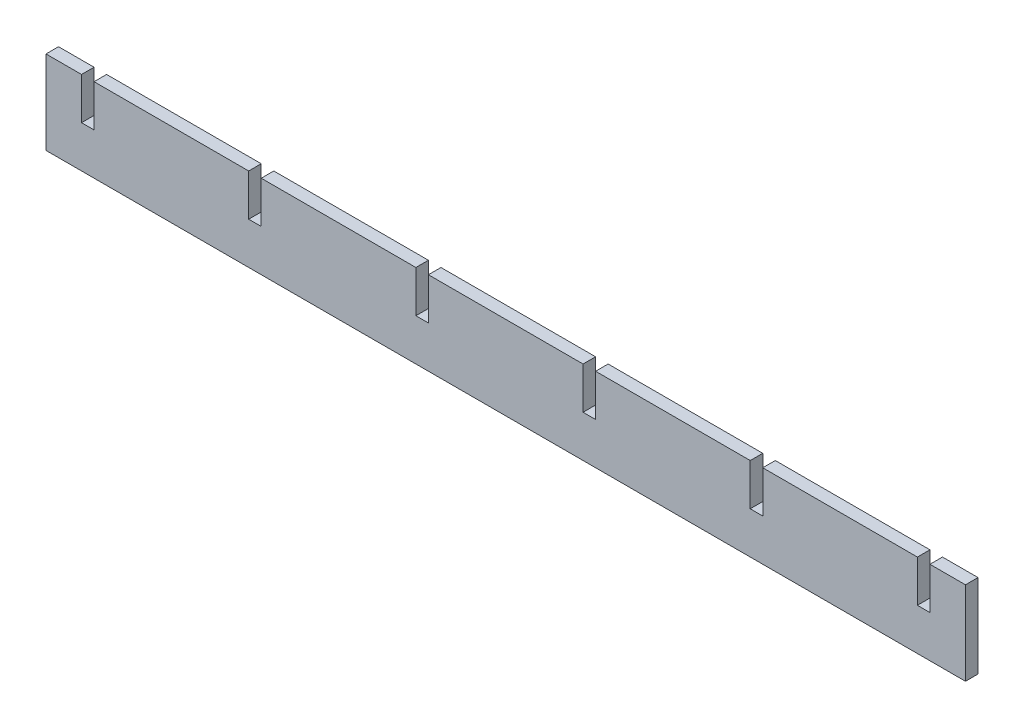
ISO-10303-21;
HEADER;
FILE_DESCRIPTION(('STEP AP214'),'2;1');
FILE_NAME('part.step','',(''),(''),'','','');
FILE_SCHEMA(('AUTOMOTIVE_DESIGN { 1 0 10303 214 1 1 1 1 }'));
ENDSEC;
DATA;
#1=APPLICATION_CONTEXT('core data for automotive mechanical design processes');
#2=APPLICATION_PROTOCOL_DEFINITION('international standard','automotive_design',2000,#1);
#3=PRODUCT_CONTEXT('',#1,'mechanical');
#4=PRODUCT('Part','Part','',(#3));
#5=PRODUCT_RELATED_PRODUCT_CATEGORY('part','',(#4));
#6=PRODUCT_DEFINITION_FORMATION('','',#4);
#7=PRODUCT_DEFINITION_CONTEXT('part definition',#1,'design');
#8=PRODUCT_DEFINITION('design','',#6,#7);
#9=PRODUCT_DEFINITION_SHAPE('','',#8);
#10=(LENGTH_UNIT() NAMED_UNIT(*) SI_UNIT(.MILLI.,.METRE.));
#11=(NAMED_UNIT(*) PLANE_ANGLE_UNIT() SI_UNIT($,.RADIAN.));
#12=(NAMED_UNIT(*) SI_UNIT($,.STERADIAN.) SOLID_ANGLE_UNIT());
#13=UNCERTAINTY_MEASURE_WITH_UNIT(LENGTH_MEASURE(1.E-05),#10,'distance_accuracy_value','');
#14=(GEOMETRIC_REPRESENTATION_CONTEXT(3) GLOBAL_UNCERTAINTY_ASSIGNED_CONTEXT((#13)) GLOBAL_UNIT_ASSIGNED_CONTEXT((#10,
#11,#12)) REPRESENTATION_CONTEXT('',''));
#15=CARTESIAN_POINT('',(0.,0.,0.));
#16=DIRECTION('',(0.,0.,1.));
#17=DIRECTION('',(1.,0.,0.));
#18=AXIS2_PLACEMENT_3D('',#15,#16,#17);
#19=CARTESIAN_POINT('',(0.,20.,3.));
#20=DIRECTION('',(0.,-1.,0.));
#21=DIRECTION('',(0.,0.,-1.));
#22=AXIS2_PLACEMENT_3D('',#19,#20,#21);
#23=PLANE('',#22);
#24=DIRECTION('',(0.,0.,-1.));
#25=VECTOR('',#24,1.);
#26=CARTESIAN_POINT('',(48.5,20.,3.));
#27=LINE('',#26,#25);
#28=CARTESIAN_POINT('',(48.5,20.,3.));
#29=VERTEX_POINT('',#28);
#30=CARTESIAN_POINT('',(48.5,20.,0.));
#31=VERTEX_POINT('',#30);
#32=EDGE_CURVE('E233',#29,#31,#27,.T.);
#33=ORIENTED_EDGE('',*,*,#32,.T.);
#34=DIRECTION('',(-1.,0.,0.));
#35=VECTOR('',#34,1.);
#36=CARTESIAN_POINT('',(0.,20.,0.));
#37=LINE('',#36,#35);
#38=CARTESIAN_POINT('',(11.5,20.,0.));
#39=VERTEX_POINT('',#38);
#40=EDGE_CURVE('E480',#31,#39,#37,.T.);
#41=ORIENTED_EDGE('',*,*,#40,.T.);
#42=DIRECTION('',(0.,0.,-1.));
#43=VECTOR('',#42,1.);
#44=CARTESIAN_POINT('',(11.5,20.,3.));
#45=LINE('',#44,#43);
#46=CARTESIAN_POINT('',(11.5,20.,3.));
#47=VERTEX_POINT('',#46);
#48=EDGE_CURVE('E435',#47,#39,#45,.T.);
#49=ORIENTED_EDGE('',*,*,#48,.F.);
#50=DIRECTION('',(-1.,0.,0.));
#51=VECTOR('',#50,1.);
#52=CARTESIAN_POINT('',(0.,20.,3.));
#53=LINE('',#52,#51);
#54=EDGE_CURVE('E465',#29,#47,#53,.T.);
#55=ORIENTED_EDGE('',*,*,#54,.F.);
#56=EDGE_LOOP('',(#33,#41,#49,#55));
#57=FACE_BOUND('',#56,.T.);
#58=ADVANCED_FACE('F39',(#57),#23,.F.);
#59=DIRECTION('',(0.,0.,-1.));
#60=VECTOR('',#59,1.);
#61=CARTESIAN_POINT('',(51.5,20.,3.));
#62=LINE('',#61,#60);
#63=CARTESIAN_POINT('',(51.5,20.,3.));
#64=VERTEX_POINT('',#63);
#65=CARTESIAN_POINT('',(51.5,20.,0.));
#66=VERTEX_POINT('',#65);
#67=EDGE_CURVE('E55',#64,#66,#62,.T.);
#68=ORIENTED_EDGE('',*,*,#67,.F.);
#69=CARTESIAN_POINT('',(88.5,20.,3.));
#70=VERTEX_POINT('',#69);
#71=EDGE_CURVE('E589',#70,#64,#53,.T.);
#72=ORIENTED_EDGE('',*,*,#71,.F.);
#73=DIRECTION('',(0.,0.,-1.));
#74=VECTOR('',#73,1.);
#75=CARTESIAN_POINT('',(88.5,20.,3.));
#76=LINE('',#75,#74);
#77=CARTESIAN_POINT('',(88.5,20.,0.));
#78=VERTEX_POINT('',#77);
#79=EDGE_CURVE('E283',#70,#78,#76,.T.);
#80=ORIENTED_EDGE('',*,*,#79,.T.);
#81=EDGE_CURVE('E517',#78,#66,#37,.T.);
#82=ORIENTED_EDGE('',*,*,#81,.T.);
#83=EDGE_LOOP('',(#68,#72,#80,#82));
#84=FACE_BOUND('',#83,.T.);
#85=ADVANCED_FACE('F538',(#84),#23,.F.);
#86=DIRECTION('',(0.,0.,-1.));
#87=VECTOR('',#86,1.);
#88=CARTESIAN_POINT('',(91.5,20.,3.));
#89=LINE('',#88,#87);
#90=CARTESIAN_POINT('',(91.5,20.,3.));
#91=VERTEX_POINT('',#90);
#92=CARTESIAN_POINT('',(91.5,20.,0.));
#93=VERTEX_POINT('',#92);
#94=EDGE_CURVE('E63',#91,#93,#89,.T.);
#95=ORIENTED_EDGE('',*,*,#94,.F.);
#96=CARTESIAN_POINT('',(128.5,20.,3.));
#97=VERTEX_POINT('',#96);
#98=EDGE_CURVE('E584',#97,#91,#53,.T.);
#99=ORIENTED_EDGE('',*,*,#98,.F.);
#100=DIRECTION('',(0.,0.,-1.));
#101=VECTOR('',#100,1.);
#102=CARTESIAN_POINT('',(128.5,20.,3.));
#103=LINE('',#102,#101);
#104=CARTESIAN_POINT('',(128.5,20.,0.));
#105=VERTEX_POINT('',#104);
#106=EDGE_CURVE('E316',#97,#105,#103,.T.);
#107=ORIENTED_EDGE('',*,*,#106,.T.);
#108=EDGE_CURVE('E526',#105,#93,#37,.T.);
#109=ORIENTED_EDGE('',*,*,#108,.T.);
#110=EDGE_LOOP('',(#95,#99,#107,#109));
#111=FACE_BOUND('',#110,.T.);
#112=ADVANCED_FACE('F554',(#111),#23,.F.);
#113=DIRECTION('',(0.,0.,-1.));
#114=VECTOR('',#113,1.);
#115=CARTESIAN_POINT('',(131.5,20.,3.));
#116=LINE('',#115,#114);
#117=CARTESIAN_POINT('',(131.5,20.,3.));
#118=VERTEX_POINT('',#117);
#119=CARTESIAN_POINT('',(131.5,20.,0.));
#120=VERTEX_POINT('',#119);
#121=EDGE_CURVE('E332',#118,#120,#116,.T.);
#122=ORIENTED_EDGE('',*,*,#121,.F.);
#123=CARTESIAN_POINT('',(168.5,20.,3.));
#124=VERTEX_POINT('',#123);
#125=EDGE_CURVE('E581',#124,#118,#53,.T.);
#126=ORIENTED_EDGE('',*,*,#125,.F.);
#127=DIRECTION('',(0.,0.,-1.));
#128=VECTOR('',#127,1.);
#129=CARTESIAN_POINT('',(168.5,20.,3.));
#130=LINE('',#129,#128);
#131=CARTESIAN_POINT('',(168.5,20.,0.));
#132=VERTEX_POINT('',#131);
#133=EDGE_CURVE('E351',#124,#132,#130,.T.);
#134=ORIENTED_EDGE('',*,*,#133,.T.);
#135=EDGE_CURVE('E520',#132,#120,#37,.T.);
#136=ORIENTED_EDGE('',*,*,#135,.T.);
#137=EDGE_LOOP('',(#122,#126,#134,#136));
#138=FACE_BOUND('',#137,.T.);
#139=ADVANCED_FACE('F569',(#138),#23,.F.);
#140=DIRECTION('',(0.,0.,-1.));
#141=VECTOR('',#140,1.);
#142=CARTESIAN_POINT('',(171.5,20.,3.));
#143=LINE('',#142,#141);
#144=CARTESIAN_POINT('',(171.5,20.,3.));
#145=VERTEX_POINT('',#144);
#146=CARTESIAN_POINT('',(171.5,20.,0.));
#147=VERTEX_POINT('',#146);
#148=EDGE_CURVE('E367',#145,#147,#143,.T.);
#149=ORIENTED_EDGE('',*,*,#148,.F.);
#150=CARTESIAN_POINT('',(208.5,20.,3.));
#151=VERTEX_POINT('',#150);
#152=EDGE_CURVE('E464',#151,#145,#53,.T.);
#153=ORIENTED_EDGE('',*,*,#152,.F.);
#154=DIRECTION('',(0.,0.,-1.));
#155=VECTOR('',#154,1.);
#156=CARTESIAN_POINT('',(208.5,20.,3.));
#157=LINE('',#156,#155);
#158=CARTESIAN_POINT('',(208.5,20.,0.));
#159=VERTEX_POINT('',#158);
#160=EDGE_CURVE('E386',#151,#159,#157,.T.);
#161=ORIENTED_EDGE('',*,*,#160,.T.);
#162=EDGE_CURVE('E479',#159,#147,#37,.T.);
#163=ORIENTED_EDGE('',*,*,#162,.T.);
#164=EDGE_LOOP('',(#149,#153,#161,#163));
#165=FACE_BOUND('',#164,.T.);
#166=ADVANCED_FACE('F563',(#165),#23,.F.);
#167=DIRECTION('',(0.,0.,-1.));
#168=VECTOR('',#167,1.);
#169=CARTESIAN_POINT('',(211.5,20.,3.));
#170=LINE('',#169,#168);
#171=CARTESIAN_POINT('',(211.5,20.,3.));
#172=VERTEX_POINT('',#171);
#173=CARTESIAN_POINT('',(211.5,20.,0.));
#174=VERTEX_POINT('',#173);
#175=EDGE_CURVE('E401',#172,#174,#170,.T.);
#176=ORIENTED_EDGE('',*,*,#175,.F.);
#177=CARTESIAN_POINT('',(220.,20.,3.));
#178=VERTEX_POINT('',#177);
#179=EDGE_CURVE('E459',#178,#172,#53,.T.);
#180=ORIENTED_EDGE('',*,*,#179,.F.);
#181=DIRECTION('',(0.,0.,-1.));
#182=VECTOR('',#181,1.);
#183=CARTESIAN_POINT('',(220.,20.,3.));
#184=LINE('',#183,#182);
#185=CARTESIAN_POINT('',(220.,20.,0.));
#186=VERTEX_POINT('',#185);
#187=EDGE_CURVE('E484',#178,#186,#184,.T.);
#188=ORIENTED_EDGE('',*,*,#187,.T.);
#189=EDGE_CURVE('E452',#186,#174,#37,.T.);
#190=ORIENTED_EDGE('',*,*,#189,.T.);
#191=EDGE_LOOP('',(#176,#180,#188,#190));
#192=FACE_BOUND('',#191,.T.);
#193=ADVANCED_FACE('F504',(#192),#23,.F.);
#194=CARTESIAN_POINT('',(0.,0.,3.));
#195=DIRECTION('',(0.,0.,-1.));
#196=DIRECTION('',(-1.,0.,0.));
#197=AXIS2_PLACEMENT_3D('',#194,#195,#196);
#198=PLANE('',#197);
#199=DIRECTION('',(0.,-1.,0.));
#200=VECTOR('',#199,1.);
#201=CARTESIAN_POINT('',(48.5,20.,3.));
#202=LINE('',#201,#200);
#203=CARTESIAN_POINT('',(48.5,10.,3.));
#204=VERTEX_POINT('',#203);
#205=EDGE_CURVE('E227',#29,#204,#202,.T.);
#206=ORIENTED_EDGE('',*,*,#205,.F.);
#207=ORIENTED_EDGE('',*,*,#54,.T.);
#208=DIRECTION('',(0.,1.,0.));
#209=VECTOR('',#208,1.);
#210=CARTESIAN_POINT('',(11.5,20.,3.));
#211=LINE('',#210,#209);
#212=CARTESIAN_POINT('',(11.5,10.,3.));
#213=VERTEX_POINT('',#212);
#214=EDGE_CURVE('E417',#213,#47,#211,.T.);
#215=ORIENTED_EDGE('',*,*,#214,.F.);
#216=DIRECTION('',(1.,0.,0.));
#217=VECTOR('',#216,1.);
#218=CARTESIAN_POINT('',(8.5,10.,3.));
#219=LINE('',#218,#217);
#220=CARTESIAN_POINT('',(8.5,10.,3.));
#221=VERTEX_POINT('',#220);
#222=EDGE_CURVE('E413',#221,#213,#219,.T.);
#223=ORIENTED_EDGE('',*,*,#222,.F.);
#224=DIRECTION('',(0.,-1.,0.));
#225=VECTOR('',#224,1.);
#226=CARTESIAN_POINT('',(8.5,20.,3.));
#227=LINE('',#226,#225);
#228=CARTESIAN_POINT('',(8.5,20.,3.));
#229=VERTEX_POINT('',#228);
#230=EDGE_CURVE('E410',#229,#221,#227,.T.);
#231=ORIENTED_EDGE('',*,*,#230,.F.);
#232=CARTESIAN_POINT('',(0.,20.,3.));
#233=VERTEX_POINT('',#232);
#234=EDGE_CURVE('E458',#229,#233,#53,.T.);
#235=ORIENTED_EDGE('',*,*,#234,.T.);
#236=DIRECTION('',(0.,-1.,0.));
#237=VECTOR('',#236,1.);
#238=CARTESIAN_POINT('',(0.,0.,3.));
#239=LINE('',#238,#237);
#240=CARTESIAN_POINT('',(0.,0.,3.));
#241=VERTEX_POINT('',#240);
#242=EDGE_CURVE('E447',#233,#241,#239,.T.);
#243=ORIENTED_EDGE('',*,*,#242,.T.);
#244=DIRECTION('',(1.,0.,0.));
#245=VECTOR('',#244,1.);
#246=CARTESIAN_POINT('',(0.,0.,3.));
#247=LINE('',#246,#245);
#248=CARTESIAN_POINT('',(220.,0.,3.));
#249=VERTEX_POINT('',#248);
#250=EDGE_CURVE('E451',#241,#249,#247,.T.);
#251=ORIENTED_EDGE('',*,*,#250,.T.);
#252=DIRECTION('',(0.,1.,0.));
#253=VECTOR('',#252,1.);
#254=CARTESIAN_POINT('',(220.,0.,3.));
#255=LINE('',#254,#253);
#256=EDGE_CURVE('E455',#249,#178,#255,.T.);
#257=ORIENTED_EDGE('',*,*,#256,.T.);
#258=ORIENTED_EDGE('',*,*,#179,.T.);
#259=DIRECTION('',(0.,1.,0.));
#260=VECTOR('',#259,1.);
#261=CARTESIAN_POINT('',(211.5,20.,3.));
#262=LINE('',#261,#260);
#263=CARTESIAN_POINT('',(211.5,10.,3.));
#264=VERTEX_POINT('',#263);
#265=EDGE_CURVE('E383',#264,#172,#262,.T.);
#266=ORIENTED_EDGE('',*,*,#265,.F.);
#267=DIRECTION('',(1.,0.,0.));
#268=VECTOR('',#267,1.);
#269=CARTESIAN_POINT('',(208.5,10.,3.));
#270=LINE('',#269,#268);
#271=CARTESIAN_POINT('',(208.5,10.,3.));
#272=VERTEX_POINT('',#271);
#273=EDGE_CURVE('E379',#272,#264,#270,.T.);
#274=ORIENTED_EDGE('',*,*,#273,.F.);
#275=DIRECTION('',(0.,-1.,0.));
#276=VECTOR('',#275,1.);
#277=CARTESIAN_POINT('',(208.5,20.,3.));
#278=LINE('',#277,#276);
#279=EDGE_CURVE('E376',#151,#272,#278,.T.);
#280=ORIENTED_EDGE('',*,*,#279,.F.);
#281=ORIENTED_EDGE('',*,*,#152,.T.);
#282=DIRECTION('',(0.,1.,0.));
#283=VECTOR('',#282,1.);
#284=CARTESIAN_POINT('',(171.5,20.,3.));
#285=LINE('',#284,#283);
#286=CARTESIAN_POINT('',(171.5,10.,3.));
#287=VERTEX_POINT('',#286);
#288=EDGE_CURVE('E348',#287,#145,#285,.T.);
#289=ORIENTED_EDGE('',*,*,#288,.F.);
#290=DIRECTION('',(1.,0.,0.));
#291=VECTOR('',#290,1.);
#292=CARTESIAN_POINT('',(168.5,10.,3.));
#293=LINE('',#292,#291);
#294=CARTESIAN_POINT('',(168.5,10.,3.));
#295=VERTEX_POINT('',#294);
#296=EDGE_CURVE('E344',#295,#287,#293,.T.);
#297=ORIENTED_EDGE('',*,*,#296,.F.);
#298=DIRECTION('',(0.,-1.,0.));
#299=VECTOR('',#298,1.);
#300=CARTESIAN_POINT('',(168.5,20.,3.));
#301=LINE('',#300,#299);
#302=EDGE_CURVE('E341',#124,#295,#301,.T.);
#303=ORIENTED_EDGE('',*,*,#302,.F.);
#304=ORIENTED_EDGE('',*,*,#125,.T.);
#305=DIRECTION('',(0.,1.,0.));
#306=VECTOR('',#305,1.);
#307=CARTESIAN_POINT('',(131.5,20.,3.));
#308=LINE('',#307,#306);
#309=CARTESIAN_POINT('',(131.5,10.,3.));
#310=VERTEX_POINT('',#309);
#311=EDGE_CURVE('E313',#310,#118,#308,.T.);
#312=ORIENTED_EDGE('',*,*,#311,.F.);
#313=DIRECTION('',(1.,0.,0.));
#314=VECTOR('',#313,1.);
#315=CARTESIAN_POINT('',(128.5,10.,3.));
#316=LINE('',#315,#314);
#317=CARTESIAN_POINT('',(128.5,10.,3.));
#318=VERTEX_POINT('',#317);
#319=EDGE_CURVE('E309',#318,#310,#316,.T.);
#320=ORIENTED_EDGE('',*,*,#319,.F.);
#321=DIRECTION('',(0.,-1.,0.));
#322=VECTOR('',#321,1.);
#323=CARTESIAN_POINT('',(128.5,20.,3.));
#324=LINE('',#323,#322);
#325=EDGE_CURVE('E306',#97,#318,#324,.T.);
#326=ORIENTED_EDGE('',*,*,#325,.F.);
#327=ORIENTED_EDGE('',*,*,#98,.T.);
#328=DIRECTION('',(0.,1.,0.));
#329=VECTOR('',#328,1.);
#330=CARTESIAN_POINT('',(91.5,20.,3.));
#331=LINE('',#330,#329);
#332=CARTESIAN_POINT('',(91.5,10.,3.));
#333=VERTEX_POINT('',#332);
#334=EDGE_CURVE('E280',#333,#91,#331,.T.);
#335=ORIENTED_EDGE('',*,*,#334,.F.);
#336=DIRECTION('',(1.,0.,0.));
#337=VECTOR('',#336,1.);
#338=CARTESIAN_POINT('',(88.5,10.,3.));
#339=LINE('',#338,#337);
#340=CARTESIAN_POINT('',(88.5,10.,3.));
#341=VERTEX_POINT('',#340);
#342=EDGE_CURVE('E276',#341,#333,#339,.T.);
#343=ORIENTED_EDGE('',*,*,#342,.F.);
#344=DIRECTION('',(0.,-1.,0.));
#345=VECTOR('',#344,1.);
#346=CARTESIAN_POINT('',(88.5,20.,3.));
#347=LINE('',#346,#345);
#348=EDGE_CURVE('E273',#70,#341,#347,.T.);
#349=ORIENTED_EDGE('',*,*,#348,.F.);
#350=ORIENTED_EDGE('',*,*,#71,.T.);
#351=DIRECTION('',(0.,1.,0.));
#352=VECTOR('',#351,1.);
#353=CARTESIAN_POINT('',(51.5,20.,3.));
#354=LINE('',#353,#352);
#355=CARTESIAN_POINT('',(51.5,10.,3.));
#356=VERTEX_POINT('',#355);
#357=EDGE_CURVE('E253',#356,#64,#354,.T.);
#358=ORIENTED_EDGE('',*,*,#357,.F.);
#359=DIRECTION('',(1.,0.,0.));
#360=VECTOR('',#359,1.);
#361=CARTESIAN_POINT('',(48.5,10.,3.));
#362=LINE('',#361,#360);
#363=EDGE_CURVE('E238',#204,#356,#362,.T.);
#364=ORIENTED_EDGE('',*,*,#363,.F.);
#365=EDGE_LOOP('',(#206,#207,#215,#223,#231,#235,#243,#251,#257,#258,#266,#274,#280,#281,#289,
#297,#303,#304,#312,#320,#326,#327,#335,#343,#349,#350,#358,#364));
#366=FACE_BOUND('',#365,.T.);
#367=ADVANCED_FACE('F251',(#366),#198,.F.);
#368=CARTESIAN_POINT('',(0.,0.,0.));
#369=DIRECTION('',(0.,0.,-1.));
#370=DIRECTION('',(-1.,0.,0.));
#371=AXIS2_PLACEMENT_3D('',#368,#369,#370);
#372=PLANE('',#371);
#373=ORIENTED_EDGE('',*,*,#40,.F.);
#374=DIRECTION('',(0.,-1.,0.));
#375=VECTOR('',#374,1.);
#376=CARTESIAN_POINT('',(48.5,20.,0.));
#377=LINE('',#376,#375);
#378=CARTESIAN_POINT('',(48.5,10.,0.));
#379=VERTEX_POINT('',#378);
#380=EDGE_CURVE('E259',#31,#379,#377,.T.);
#381=ORIENTED_EDGE('',*,*,#380,.T.);
#382=DIRECTION('',(1.,0.,0.));
#383=VECTOR('',#382,1.);
#384=CARTESIAN_POINT('',(48.5,10.,0.));
#385=LINE('',#384,#383);
#386=CARTESIAN_POINT('',(51.5,10.,0.));
#387=VERTEX_POINT('',#386);
#388=EDGE_CURVE('E245',#379,#387,#385,.T.);
#389=ORIENTED_EDGE('',*,*,#388,.T.);
#390=DIRECTION('',(0.,1.,0.));
#391=VECTOR('',#390,1.);
#392=CARTESIAN_POINT('',(51.5,20.,0.));
#393=LINE('',#392,#391);
#394=EDGE_CURVE('E239',#387,#66,#393,.T.);
#395=ORIENTED_EDGE('',*,*,#394,.T.);
#396=ORIENTED_EDGE('',*,*,#81,.F.);
#397=DIRECTION('',(0.,-1.,0.));
#398=VECTOR('',#397,1.);
#399=CARTESIAN_POINT('',(88.5,20.,0.));
#400=LINE('',#399,#398);
#401=CARTESIAN_POINT('',(88.5,10.,0.));
#402=VERTEX_POINT('',#401);
#403=EDGE_CURVE('E284',#78,#402,#400,.T.);
#404=ORIENTED_EDGE('',*,*,#403,.T.);
#405=DIRECTION('',(1.,0.,0.));
#406=VECTOR('',#405,1.);
#407=CARTESIAN_POINT('',(88.5,10.,0.));
#408=LINE('',#407,#406);
#409=CARTESIAN_POINT('',(91.5,10.,0.));
#410=VERTEX_POINT('',#409);
#411=EDGE_CURVE('E288',#402,#410,#408,.T.);
#412=ORIENTED_EDGE('',*,*,#411,.T.);
#413=DIRECTION('',(0.,1.,0.));
#414=VECTOR('',#413,1.);
#415=CARTESIAN_POINT('',(91.5,20.,0.));
#416=LINE('',#415,#414);
#417=EDGE_CURVE('E277',#410,#93,#416,.T.);
#418=ORIENTED_EDGE('',*,*,#417,.T.);
#419=ORIENTED_EDGE('',*,*,#108,.F.);
#420=DIRECTION('',(0.,-1.,0.));
#421=VECTOR('',#420,1.);
#422=CARTESIAN_POINT('',(128.5,20.,0.));
#423=LINE('',#422,#421);
#424=CARTESIAN_POINT('',(128.5,10.,0.));
#425=VERTEX_POINT('',#424);
#426=EDGE_CURVE('E317',#105,#425,#423,.T.);
#427=ORIENTED_EDGE('',*,*,#426,.T.);
#428=DIRECTION('',(1.,0.,0.));
#429=VECTOR('',#428,1.);
#430=CARTESIAN_POINT('',(128.5,10.,0.));
#431=LINE('',#430,#429);
#432=CARTESIAN_POINT('',(131.5,10.,0.));
#433=VERTEX_POINT('',#432);
#434=EDGE_CURVE('E321',#425,#433,#431,.T.);
#435=ORIENTED_EDGE('',*,*,#434,.T.);
#436=DIRECTION('',(0.,1.,0.));
#437=VECTOR('',#436,1.);
#438=CARTESIAN_POINT('',(131.5,20.,0.));
#439=LINE('',#438,#437);
#440=EDGE_CURVE('E310',#433,#120,#439,.T.);
#441=ORIENTED_EDGE('',*,*,#440,.T.);
#442=ORIENTED_EDGE('',*,*,#135,.F.);
#443=DIRECTION('',(0.,-1.,0.));
#444=VECTOR('',#443,1.);
#445=CARTESIAN_POINT('',(168.5,20.,0.));
#446=LINE('',#445,#444);
#447=CARTESIAN_POINT('',(168.5,10.,0.));
#448=VERTEX_POINT('',#447);
#449=EDGE_CURVE('E352',#132,#448,#446,.T.);
#450=ORIENTED_EDGE('',*,*,#449,.T.);
#451=DIRECTION('',(1.,0.,0.));
#452=VECTOR('',#451,1.);
#453=CARTESIAN_POINT('',(168.5,10.,0.));
#454=LINE('',#453,#452);
#455=CARTESIAN_POINT('',(171.5,10.,0.));
#456=VERTEX_POINT('',#455);
#457=EDGE_CURVE('E356',#448,#456,#454,.T.);
#458=ORIENTED_EDGE('',*,*,#457,.T.);
#459=DIRECTION('',(0.,1.,0.));
#460=VECTOR('',#459,1.);
#461=CARTESIAN_POINT('',(171.5,20.,0.));
#462=LINE('',#461,#460);
#463=EDGE_CURVE('E345',#456,#147,#462,.T.);
#464=ORIENTED_EDGE('',*,*,#463,.T.);
#465=ORIENTED_EDGE('',*,*,#162,.F.);
#466=DIRECTION('',(0.,-1.,0.));
#467=VECTOR('',#466,1.);
#468=CARTESIAN_POINT('',(208.5,20.,0.));
#469=LINE('',#468,#467);
#470=CARTESIAN_POINT('',(208.5,10.,0.));
#471=VERTEX_POINT('',#470);
#472=EDGE_CURVE('E387',#159,#471,#469,.T.);
#473=ORIENTED_EDGE('',*,*,#472,.T.);
#474=DIRECTION('',(1.,0.,0.));
#475=VECTOR('',#474,1.);
#476=CARTESIAN_POINT('',(208.5,10.,0.));
#477=LINE('',#476,#475);
#478=CARTESIAN_POINT('',(211.5,10.,0.));
#479=VERTEX_POINT('',#478);
#480=EDGE_CURVE('E391',#471,#479,#477,.T.);
#481=ORIENTED_EDGE('',*,*,#480,.T.);
#482=DIRECTION('',(0.,1.,0.));
#483=VECTOR('',#482,1.);
#484=CARTESIAN_POINT('',(211.5,20.,0.));
#485=LINE('',#484,#483);
#486=EDGE_CURVE('E380',#479,#174,#485,.T.);
#487=ORIENTED_EDGE('',*,*,#486,.T.);
#488=ORIENTED_EDGE('',*,*,#189,.F.);
#489=DIRECTION('',(0.,1.,0.));
#490=VECTOR('',#489,1.);
#491=CARTESIAN_POINT('',(220.,0.,0.));
#492=LINE('',#491,#490);
#493=CARTESIAN_POINT('',(220.,0.,0.));
#494=VERTEX_POINT('',#493);
#495=EDGE_CURVE('E472',#494,#186,#492,.T.);
#496=ORIENTED_EDGE('',*,*,#495,.F.);
#497=DIRECTION('',(1.,0.,0.));
#498=VECTOR('',#497,1.);
#499=CARTESIAN_POINT('',(0.,0.,0.));
#500=LINE('',#499,#498);
#501=CARTESIAN_POINT('',(0.,0.,0.));
#502=VERTEX_POINT('',#501);
#503=EDGE_CURVE('E469',#502,#494,#500,.T.);
#504=ORIENTED_EDGE('',*,*,#503,.F.);
#505=DIRECTION('',(0.,-1.,0.));
#506=VECTOR('',#505,1.);
#507=CARTESIAN_POINT('',(0.,0.,0.));
#508=LINE('',#507,#506);
#509=CARTESIAN_POINT('',(0.,20.,0.));
#510=VERTEX_POINT('',#509);
#511=EDGE_CURVE('E446',#510,#502,#508,.T.);
#512=ORIENTED_EDGE('',*,*,#511,.F.);
#513=CARTESIAN_POINT('',(8.5,20.,0.));
#514=VERTEX_POINT('',#513);
#515=EDGE_CURVE('E475',#514,#510,#37,.T.);
#516=ORIENTED_EDGE('',*,*,#515,.F.);
#517=DIRECTION('',(0.,-1.,0.));
#518=VECTOR('',#517,1.);
#519=CARTESIAN_POINT('',(8.5,20.,0.));
#520=LINE('',#519,#518);
#521=CARTESIAN_POINT('',(8.5,10.,0.));
#522=VERTEX_POINT('',#521);
#523=EDGE_CURVE('E247',#514,#522,#520,.T.);
#524=ORIENTED_EDGE('',*,*,#523,.T.);
#525=DIRECTION('',(1.,0.,0.));
#526=VECTOR('',#525,1.);
#527=CARTESIAN_POINT('',(8.5,10.,0.));
#528=LINE('',#527,#526);
#529=CARTESIAN_POINT('',(11.5,10.,0.));
#530=VERTEX_POINT('',#529);
#531=EDGE_CURVE('E425',#522,#530,#528,.T.);
#532=ORIENTED_EDGE('',*,*,#531,.T.);
#533=DIRECTION('',(0.,1.,0.));
#534=VECTOR('',#533,1.);
#535=CARTESIAN_POINT('',(11.5,20.,0.));
#536=LINE('',#535,#534);
#537=EDGE_CURVE('E414',#530,#39,#536,.T.);
#538=ORIENTED_EDGE('',*,*,#537,.T.);
#539=EDGE_LOOP('',(#373,#381,#389,#395,#396,#404,#412,#418,#419,#427,#435,#441,#442,#450,#458,
#464,#465,#473,#481,#487,#488,#496,#504,#512,#516,#524,#532,#538));
#540=FACE_BOUND('',#539,.T.);
#541=ADVANCED_FACE('F499',(#540),#372,.T.);
#542=DIRECTION('',(0.,0.,-1.));
#543=VECTOR('',#542,1.);
#544=CARTESIAN_POINT('',(8.5,20.,3.));
#545=LINE('',#544,#543);
#546=EDGE_CURVE('E421',#229,#514,#545,.T.);
#547=ORIENTED_EDGE('',*,*,#546,.T.);
#548=ORIENTED_EDGE('',*,*,#515,.T.);
#549=DIRECTION('',(0.,0.,-1.));
#550=VECTOR('',#549,1.);
#551=CARTESIAN_POINT('',(0.,20.,3.));
#552=LINE('',#551,#550);
#553=EDGE_CURVE('E463',#233,#510,#552,.T.);
#554=ORIENTED_EDGE('',*,*,#553,.F.);
#555=ORIENTED_EDGE('',*,*,#234,.F.);
#556=EDGE_LOOP('',(#547,#548,#554,#555));
#557=FACE_BOUND('',#556,.T.);
#558=ADVANCED_FACE('F550',(#557),#23,.F.);
#559=CARTESIAN_POINT('',(0.,0.,3.));
#560=DIRECTION('',(1.,0.,0.));
#561=DIRECTION('',(0.,0.,-1.));
#562=AXIS2_PLACEMENT_3D('',#559,#560,#561);
#563=PLANE('',#562);
#564=ORIENTED_EDGE('',*,*,#511,.T.);
#565=DIRECTION('',(0.,0.,-1.));
#566=VECTOR('',#565,1.);
#567=CARTESIAN_POINT('',(0.,0.,3.));
#568=LINE('',#567,#566);
#569=EDGE_CURVE('E11',#241,#502,#568,.T.);
#570=ORIENTED_EDGE('',*,*,#569,.F.);
#571=ORIENTED_EDGE('',*,*,#242,.F.);
#572=ORIENTED_EDGE('',*,*,#553,.T.);
#573=EDGE_LOOP('',(#564,#570,#571,#572));
#574=FACE_BOUND('',#573,.T.);
#575=ADVANCED_FACE('F41',(#574),#563,.F.);
#576=CARTESIAN_POINT('',(0.,0.,3.));
#577=DIRECTION('',(0.,1.,0.));
#578=DIRECTION('',(0.,0.,1.));
#579=AXIS2_PLACEMENT_3D('',#576,#577,#578);
#580=PLANE('',#579);
#581=ORIENTED_EDGE('',*,*,#503,.T.);
#582=DIRECTION('',(0.,0.,-1.));
#583=VECTOR('',#582,1.);
#584=CARTESIAN_POINT('',(220.,0.,3.));
#585=LINE('',#584,#583);
#586=EDGE_CURVE('E48',#249,#494,#585,.T.);
#587=ORIENTED_EDGE('',*,*,#586,.F.);
#588=ORIENTED_EDGE('',*,*,#250,.F.);
#589=ORIENTED_EDGE('',*,*,#569,.T.);
#590=EDGE_LOOP('',(#581,#587,#588,#589));
#591=FACE_BOUND('',#590,.T.);
#592=ADVANCED_FACE('F510',(#591),#580,.F.);
#593=CARTESIAN_POINT('',(220.,0.,3.));
#594=DIRECTION('',(-1.,0.,0.));
#595=DIRECTION('',(0.,0.,1.));
#596=AXIS2_PLACEMENT_3D('',#593,#594,#595);
#597=PLANE('',#596);
#598=ORIENTED_EDGE('',*,*,#495,.T.);
#599=ORIENTED_EDGE('',*,*,#187,.F.);
#600=ORIENTED_EDGE('',*,*,#256,.F.);
#601=ORIENTED_EDGE('',*,*,#586,.T.);
#602=EDGE_LOOP('',(#598,#599,#600,#601));
#603=FACE_BOUND('',#602,.T.);
#604=ADVANCED_FACE('F493',(#603),#597,.F.);
#605=CARTESIAN_POINT('',(8.5,20.,3.));
#606=DIRECTION('',(1.,0.,0.));
#607=DIRECTION('',(0.,1.,0.));
#608=AXIS2_PLACEMENT_3D('',#605,#606,#607);
#609=PLANE('',#608);
#610=ORIENTED_EDGE('',*,*,#523,.F.);
#611=ORIENTED_EDGE('',*,*,#546,.F.);
#612=ORIENTED_EDGE('',*,*,#230,.T.);
#613=DIRECTION('',(0.,0.,-1.));
#614=VECTOR('',#613,1.);
#615=CARTESIAN_POINT('',(8.5,10.,3.));
#616=LINE('',#615,#614);
#617=EDGE_CURVE('E442',#221,#522,#616,.T.);
#618=ORIENTED_EDGE('',*,*,#617,.T.);
#619=EDGE_LOOP('',(#610,#611,#612,#618));
#620=FACE_BOUND('',#619,.T.);
#621=ADVANCED_FACE('F657',(#620),#609,.T.);
#622=CARTESIAN_POINT('',(8.5,10.,3.));
#623=DIRECTION('',(0.,1.,0.));
#624=DIRECTION('',(0.,0.,1.));
#625=AXIS2_PLACEMENT_3D('',#622,#623,#624);
#626=PLANE('',#625);
#627=ORIENTED_EDGE('',*,*,#531,.F.);
#628=ORIENTED_EDGE('',*,*,#617,.F.);
#629=ORIENTED_EDGE('',*,*,#222,.T.);
#630=DIRECTION('',(0.,0.,-1.));
#631=VECTOR('',#630,1.);
#632=CARTESIAN_POINT('',(11.5,10.,3.));
#633=LINE('',#632,#631);
#634=EDGE_CURVE('E439',#213,#530,#633,.T.);
#635=ORIENTED_EDGE('',*,*,#634,.T.);
#636=EDGE_LOOP('',(#627,#628,#629,#635));
#637=FACE_BOUND('',#636,.T.);
#638=ADVANCED_FACE('F653',(#637),#626,.T.);
#639=CARTESIAN_POINT('',(11.5,20.,3.));
#640=DIRECTION('',(-1.,0.,0.));
#641=DIRECTION('',(0.,-1.,0.));
#642=AXIS2_PLACEMENT_3D('',#639,#640,#641);
#643=PLANE('',#642);
#644=ORIENTED_EDGE('',*,*,#537,.F.);
#645=ORIENTED_EDGE('',*,*,#634,.F.);
#646=ORIENTED_EDGE('',*,*,#214,.T.);
#647=ORIENTED_EDGE('',*,*,#48,.T.);
#648=EDGE_LOOP('',(#644,#645,#646,#647));
#649=FACE_BOUND('',#648,.T.);
#650=ADVANCED_FACE('F649',(#649),#643,.T.);
#651=CARTESIAN_POINT('',(208.5,20.,3.));
#652=DIRECTION('',(1.,0.,0.));
#653=DIRECTION('',(0.,1.,0.));
#654=AXIS2_PLACEMENT_3D('',#651,#652,#653);
#655=PLANE('',#654);
#656=ORIENTED_EDGE('',*,*,#472,.F.);
#657=ORIENTED_EDGE('',*,*,#160,.F.);
#658=ORIENTED_EDGE('',*,*,#279,.T.);
#659=DIRECTION('',(0.,0.,-1.));
#660=VECTOR('',#659,1.);
#661=CARTESIAN_POINT('',(208.5,10.,3.));
#662=LINE('',#661,#660);
#663=EDGE_CURVE('E357',#272,#471,#662,.T.);
#664=ORIENTED_EDGE('',*,*,#663,.T.);
#665=EDGE_LOOP('',(#656,#657,#658,#664));
#666=FACE_BOUND('',#665,.T.);
#667=ADVANCED_FACE('F645',(#666),#655,.T.);
#668=CARTESIAN_POINT('',(208.5,10.,3.));
#669=DIRECTION('',(0.,1.,0.));
#670=DIRECTION('',(0.,0.,1.));
#671=AXIS2_PLACEMENT_3D('',#668,#669,#670);
#672=PLANE('',#671);
#673=ORIENTED_EDGE('',*,*,#480,.F.);
#674=ORIENTED_EDGE('',*,*,#663,.F.);
#675=ORIENTED_EDGE('',*,*,#273,.T.);
#676=DIRECTION('',(0.,0.,-1.));
#677=VECTOR('',#676,1.);
#678=CARTESIAN_POINT('',(211.5,10.,3.));
#679=LINE('',#678,#677);
#680=EDGE_CURVE('E404',#264,#479,#679,.T.);
#681=ORIENTED_EDGE('',*,*,#680,.T.);
#682=EDGE_LOOP('',(#673,#674,#675,#681));
#683=FACE_BOUND('',#682,.T.);
#684=ADVANCED_FACE('F641',(#683),#672,.T.);
#685=CARTESIAN_POINT('',(211.5,20.,3.));
#686=DIRECTION('',(-1.,0.,0.));
#687=DIRECTION('',(0.,-1.,0.));
#688=AXIS2_PLACEMENT_3D('',#685,#686,#687);
#689=PLANE('',#688);
#690=ORIENTED_EDGE('',*,*,#486,.F.);
#691=ORIENTED_EDGE('',*,*,#680,.F.);
#692=ORIENTED_EDGE('',*,*,#265,.T.);
#693=ORIENTED_EDGE('',*,*,#175,.T.);
#694=EDGE_LOOP('',(#690,#691,#692,#693));
#695=FACE_BOUND('',#694,.T.);
#696=ADVANCED_FACE('F637',(#695),#689,.T.);
#697=CARTESIAN_POINT('',(168.5,20.,3.));
#698=DIRECTION('',(1.,0.,0.));
#699=DIRECTION('',(0.,1.,0.));
#700=AXIS2_PLACEMENT_3D('',#697,#698,#699);
#701=PLANE('',#700);
#702=ORIENTED_EDGE('',*,*,#449,.F.);
#703=ORIENTED_EDGE('',*,*,#133,.F.);
#704=ORIENTED_EDGE('',*,*,#302,.T.);
#705=DIRECTION('',(0.,0.,-1.));
#706=VECTOR('',#705,1.);
#707=CARTESIAN_POINT('',(168.5,10.,3.));
#708=LINE('',#707,#706);
#709=EDGE_CURVE('E322',#295,#448,#708,.T.);
#710=ORIENTED_EDGE('',*,*,#709,.T.);
#711=EDGE_LOOP('',(#702,#703,#704,#710));
#712=FACE_BOUND('',#711,.T.);
#713=ADVANCED_FACE('F633',(#712),#701,.T.);
#714=CARTESIAN_POINT('',(168.5,10.,3.));
#715=DIRECTION('',(0.,1.,0.));
#716=DIRECTION('',(0.,0.,1.));
#717=AXIS2_PLACEMENT_3D('',#714,#715,#716);
#718=PLANE('',#717);
#719=ORIENTED_EDGE('',*,*,#457,.F.);
#720=ORIENTED_EDGE('',*,*,#709,.F.);
#721=ORIENTED_EDGE('',*,*,#296,.T.);
#722=DIRECTION('',(0.,0.,-1.));
#723=VECTOR('',#722,1.);
#724=CARTESIAN_POINT('',(171.5,10.,3.));
#725=LINE('',#724,#723);
#726=EDGE_CURVE('E370',#287,#456,#725,.T.);
#727=ORIENTED_EDGE('',*,*,#726,.T.);
#728=EDGE_LOOP('',(#719,#720,#721,#727));
#729=FACE_BOUND('',#728,.T.);
#730=ADVANCED_FACE('F630',(#729),#718,.T.);
#731=CARTESIAN_POINT('',(171.5,20.,3.));
#732=DIRECTION('',(-1.,0.,0.));
#733=DIRECTION('',(0.,-1.,0.));
#734=AXIS2_PLACEMENT_3D('',#731,#732,#733);
#735=PLANE('',#734);
#736=ORIENTED_EDGE('',*,*,#463,.F.);
#737=ORIENTED_EDGE('',*,*,#726,.F.);
#738=ORIENTED_EDGE('',*,*,#288,.T.);
#739=ORIENTED_EDGE('',*,*,#148,.T.);
#740=EDGE_LOOP('',(#736,#737,#738,#739));
#741=FACE_BOUND('',#740,.T.);
#742=ADVANCED_FACE('F627',(#741),#735,.T.);
#743=CARTESIAN_POINT('',(128.5,20.,3.));
#744=DIRECTION('',(1.,0.,0.));
#745=DIRECTION('',(0.,1.,0.));
#746=AXIS2_PLACEMENT_3D('',#743,#744,#745);
#747=PLANE('',#746);
#748=ORIENTED_EDGE('',*,*,#426,.F.);
#749=ORIENTED_EDGE('',*,*,#106,.F.);
#750=ORIENTED_EDGE('',*,*,#325,.T.);
#751=DIRECTION('',(0.,0.,-1.));
#752=VECTOR('',#751,1.);
#753=CARTESIAN_POINT('',(128.5,10.,3.));
#754=LINE('',#753,#752);
#755=EDGE_CURVE('E289',#318,#425,#754,.T.);
#756=ORIENTED_EDGE('',*,*,#755,.T.);
#757=EDGE_LOOP('',(#748,#749,#750,#756));
#758=FACE_BOUND('',#757,.T.);
#759=ADVANCED_FACE('F623',(#758),#747,.T.);
#760=CARTESIAN_POINT('',(128.5,10.,3.));
#761=DIRECTION('',(0.,1.,0.));
#762=DIRECTION('',(0.,0.,1.));
#763=AXIS2_PLACEMENT_3D('',#760,#761,#762);
#764=PLANE('',#763);
#765=ORIENTED_EDGE('',*,*,#434,.F.);
#766=ORIENTED_EDGE('',*,*,#755,.F.);
#767=ORIENTED_EDGE('',*,*,#319,.T.);
#768=DIRECTION('',(0.,0.,-1.));
#769=VECTOR('',#768,1.);
#770=CARTESIAN_POINT('',(131.5,10.,3.));
#771=LINE('',#770,#769);
#772=EDGE_CURVE('E335',#310,#433,#771,.T.);
#773=ORIENTED_EDGE('',*,*,#772,.T.);
#774=EDGE_LOOP('',(#765,#766,#767,#773));
#775=FACE_BOUND('',#774,.T.);
#776=ADVANCED_FACE('F616',(#775),#764,.T.);
#777=CARTESIAN_POINT('',(131.5,20.,3.));
#778=DIRECTION('',(-1.,0.,0.));
#779=DIRECTION('',(0.,-1.,0.));
#780=AXIS2_PLACEMENT_3D('',#777,#778,#779);
#781=PLANE('',#780);
#782=ORIENTED_EDGE('',*,*,#440,.F.);
#783=ORIENTED_EDGE('',*,*,#772,.F.);
#784=ORIENTED_EDGE('',*,*,#311,.T.);
#785=ORIENTED_EDGE('',*,*,#121,.T.);
#786=EDGE_LOOP('',(#782,#783,#784,#785));
#787=FACE_BOUND('',#786,.T.);
#788=ADVANCED_FACE('F609',(#787),#781,.T.);
#789=CARTESIAN_POINT('',(88.5,20.,3.));
#790=DIRECTION('',(1.,0.,0.));
#791=DIRECTION('',(0.,1.,0.));
#792=AXIS2_PLACEMENT_3D('',#789,#790,#791);
#793=PLANE('',#792);
#794=ORIENTED_EDGE('',*,*,#403,.F.);
#795=ORIENTED_EDGE('',*,*,#79,.F.);
#796=ORIENTED_EDGE('',*,*,#348,.T.);
#797=DIRECTION('',(0.,0.,-1.));
#798=VECTOR('',#797,1.);
#799=CARTESIAN_POINT('',(88.5,10.,3.));
#800=LINE('',#799,#798);
#801=EDGE_CURVE('E262',#341,#402,#800,.T.);
#802=ORIENTED_EDGE('',*,*,#801,.T.);
#803=EDGE_LOOP('',(#794,#795,#796,#802));
#804=FACE_BOUND('',#803,.T.);
#805=ADVANCED_FACE('F607',(#804),#793,.T.);
#806=CARTESIAN_POINT('',(88.5,10.,3.));
#807=DIRECTION('',(0.,1.,0.));
#808=DIRECTION('',(0.,0.,1.));
#809=AXIS2_PLACEMENT_3D('',#806,#807,#808);
#810=PLANE('',#809);
#811=ORIENTED_EDGE('',*,*,#411,.F.);
#812=ORIENTED_EDGE('',*,*,#801,.F.);
#813=ORIENTED_EDGE('',*,*,#342,.T.);
#814=DIRECTION('',(0.,0.,-1.));
#815=VECTOR('',#814,1.);
#816=CARTESIAN_POINT('',(91.5,10.,3.));
#817=LINE('',#816,#815);
#818=EDGE_CURVE('E300',#333,#410,#817,.T.);
#819=ORIENTED_EDGE('',*,*,#818,.T.);
#820=EDGE_LOOP('',(#811,#812,#813,#819));
#821=FACE_BOUND('',#820,.T.);
#822=ADVANCED_FACE('F604',(#821),#810,.T.);
#823=CARTESIAN_POINT('',(91.5,20.,3.));
#824=DIRECTION('',(-1.,0.,0.));
#825=DIRECTION('',(0.,-1.,0.));
#826=AXIS2_PLACEMENT_3D('',#823,#824,#825);
#827=PLANE('',#826);
#828=ORIENTED_EDGE('',*,*,#417,.F.);
#829=ORIENTED_EDGE('',*,*,#818,.F.);
#830=ORIENTED_EDGE('',*,*,#334,.T.);
#831=ORIENTED_EDGE('',*,*,#94,.T.);
#832=EDGE_LOOP('',(#828,#829,#830,#831));
#833=FACE_BOUND('',#832,.T.);
#834=ADVANCED_FACE('F602',(#833),#827,.T.);
#835=CARTESIAN_POINT('',(48.5,20.,3.));
#836=DIRECTION('',(1.,0.,0.));
#837=DIRECTION('',(0.,1.,0.));
#838=AXIS2_PLACEMENT_3D('',#835,#836,#837);
#839=PLANE('',#838);
#840=ORIENTED_EDGE('',*,*,#380,.F.);
#841=ORIENTED_EDGE('',*,*,#32,.F.);
#842=ORIENTED_EDGE('',*,*,#205,.T.);
#843=DIRECTION('',(0.,0.,-1.));
#844=VECTOR('',#843,1.);
#845=CARTESIAN_POINT('',(48.5,10.,3.));
#846=LINE('',#845,#844);
#847=EDGE_CURVE('E230',#204,#379,#846,.T.);
#848=ORIENTED_EDGE('',*,*,#847,.T.);
#849=EDGE_LOOP('',(#840,#841,#842,#848));
#850=FACE_BOUND('',#849,.T.);
#851=ADVANCED_FACE('F229',(#850),#839,.T.);
#852=CARTESIAN_POINT('',(48.5,10.,3.));
#853=DIRECTION('',(0.,1.,0.));
#854=DIRECTION('',(0.,0.,1.));
#855=AXIS2_PLACEMENT_3D('',#852,#853,#854);
#856=PLANE('',#855);
#857=ORIENTED_EDGE('',*,*,#388,.F.);
#858=ORIENTED_EDGE('',*,*,#847,.F.);
#859=ORIENTED_EDGE('',*,*,#363,.T.);
#860=DIRECTION('',(0.,0.,-1.));
#861=VECTOR('',#860,1.);
#862=CARTESIAN_POINT('',(51.5,10.,3.));
#863=LINE('',#862,#861);
#864=EDGE_CURVE('E248',#356,#387,#863,.T.);
#865=ORIENTED_EDGE('',*,*,#864,.T.);
#866=EDGE_LOOP('',(#857,#858,#859,#865));
#867=FACE_BOUND('',#866,.T.);
#868=ADVANCED_FACE('F242',(#867),#856,.T.);
#869=CARTESIAN_POINT('',(51.5,20.,3.));
#870=DIRECTION('',(-1.,0.,0.));
#871=DIRECTION('',(0.,-1.,0.));
#872=AXIS2_PLACEMENT_3D('',#869,#870,#871);
#873=PLANE('',#872);
#874=ORIENTED_EDGE('',*,*,#394,.F.);
#875=ORIENTED_EDGE('',*,*,#864,.F.);
#876=ORIENTED_EDGE('',*,*,#357,.T.);
#877=ORIENTED_EDGE('',*,*,#67,.T.);
#878=EDGE_LOOP('',(#874,#875,#876,#877));
#879=FACE_BOUND('',#878,.T.);
#880=ADVANCED_FACE('F540',(#879),#873,.T.);
#881=CLOSED_SHELL('',(#58,#85,#112,#139,#166,#193,#367,#541,#558,#575,#592,#604,#621,#638,#650,
#667,#684,#696,#713,#730,#742,#759,#776,#788,#805,#822,#834,#851,#868,#880));
#882=MANIFOLD_SOLID_BREP('B2',#881);
#883=ADVANCED_BREP_SHAPE_REPRESENTATION('',(#18,#882),#14);
#884=SHAPE_DEFINITION_REPRESENTATION(#9,#883);
ENDSEC;
END-ISO-10303-21;
